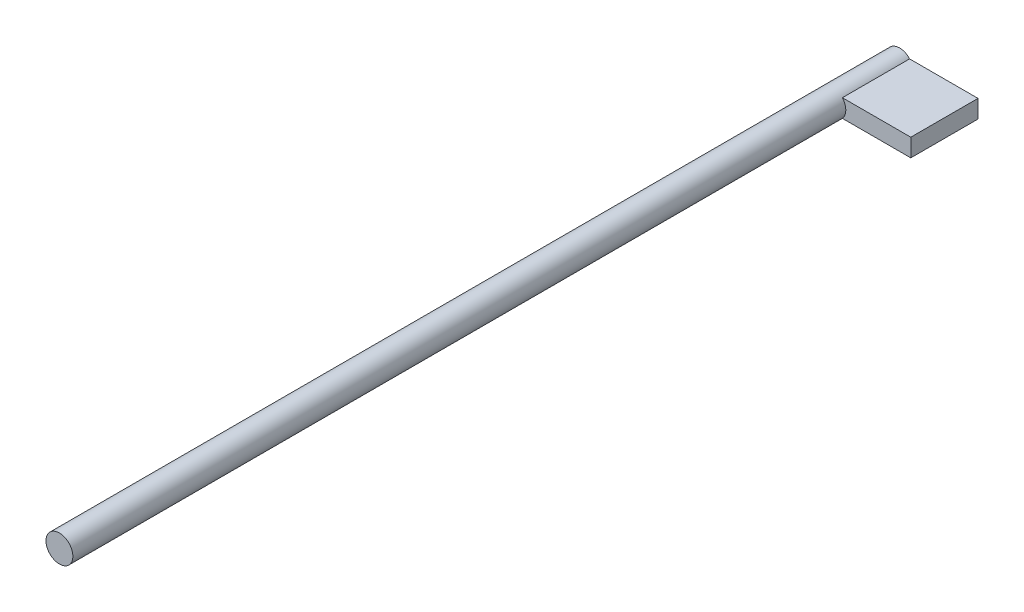
ISO-10303-21;
HEADER;
FILE_DESCRIPTION(('STEP AP214'),'2;1');
FILE_NAME('part.step','',(''),(''),'','','');
FILE_SCHEMA(('AUTOMOTIVE_DESIGN { 1 0 10303 214 1 1 1 1 }'));
ENDSEC;
DATA;
#1=APPLICATION_CONTEXT('core data for automotive mechanical design processes');
#2=APPLICATION_PROTOCOL_DEFINITION('international standard','automotive_design',2000,#1);
#3=PRODUCT_CONTEXT('',#1,'mechanical');
#4=PRODUCT('Part','Part','',(#3));
#5=PRODUCT_RELATED_PRODUCT_CATEGORY('part','',(#4));
#6=PRODUCT_DEFINITION_FORMATION('','',#4);
#7=PRODUCT_DEFINITION_CONTEXT('part definition',#1,'design');
#8=PRODUCT_DEFINITION('design','',#6,#7);
#9=PRODUCT_DEFINITION_SHAPE('','',#8);
#10=(LENGTH_UNIT() NAMED_UNIT(*) SI_UNIT(.MILLI.,.METRE.));
#11=(NAMED_UNIT(*) PLANE_ANGLE_UNIT() SI_UNIT($,.RADIAN.));
#12=(NAMED_UNIT(*) SI_UNIT($,.STERADIAN.) SOLID_ANGLE_UNIT());
#13=UNCERTAINTY_MEASURE_WITH_UNIT(LENGTH_MEASURE(1.E-05),#10,'distance_accuracy_value','');
#14=(GEOMETRIC_REPRESENTATION_CONTEXT(3) GLOBAL_UNCERTAINTY_ASSIGNED_CONTEXT((#13)) GLOBAL_UNIT_ASSIGNED_CONTEXT((#10,
#11,#12)) REPRESENTATION_CONTEXT('',''));
#15=CARTESIAN_POINT('',(0.,0.,0.));
#16=DIRECTION('',(0.,0.,1.));
#17=DIRECTION('',(1.,0.,0.));
#18=AXIS2_PLACEMENT_3D('',#15,#16,#17);
#19=CARTESIAN_POINT('',(0.,0.,-375.));
#20=DIRECTION('',(0.,0.,1.));
#21=DIRECTION('',(1.,0.,0.));
#22=AXIS2_PLACEMENT_3D('',#19,#20,#21);
#23=CYLINDRICAL_SURFACE('',#22,6.);
#24=CARTESIAN_POINT('',(0.,0.,0.));
#25=DIRECTION('',(0.,0.,1.));
#26=DIRECTION('',(1.,0.,0.));
#27=AXIS2_PLACEMENT_3D('',#24,#25,#26);
#28=CIRCLE('',#27,6.);
#29=CARTESIAN_POINT('',(6.,0.,0.));
#30=VERTEX_POINT('',#29);
#31=EDGE_CURVE('E121',#30,#30,#28,.T.);
#32=ORIENTED_EDGE('',*,*,#31,.F.);
#33=EDGE_LOOP('',(#32));
#34=FACE_BOUND('',#33,.T.);
#35=CARTESIAN_POINT('',(0.,0.,-375.));
#36=DIRECTION('',(0.,0.,1.));
#37=DIRECTION('',(1.,0.,0.));
#38=AXIS2_PLACEMENT_3D('',#35,#36,#37);
#39=CIRCLE('',#38,6.);
#40=CARTESIAN_POINT('',(4.47213595499957,4.00000000000001,-375.));
#41=VERTEX_POINT('',#40);
#42=CARTESIAN_POINT('',(4.47213595499959,-3.99999999999999,-375.));
#43=VERTEX_POINT('',#42);
#44=EDGE_CURVE('E47',#41,#43,#39,.T.);
#45=ORIENTED_EDGE('',*,*,#44,.T.);
#46=DIRECTION('',(0.,0.,1.));
#47=VECTOR('',#46,1.);
#48=CARTESIAN_POINT('',(4.47213595499959,-3.99999999999999,-375.));
#49=LINE('',#48,#47);
#50=CARTESIAN_POINT('',(4.47213595499959,-3.99999999999999,-345.));
#51=VERTEX_POINT('',#50);
#52=EDGE_CURVE('E54',#43,#51,#49,.T.);
#53=ORIENTED_EDGE('',*,*,#52,.T.);
#54=CARTESIAN_POINT('',(0.,0.,-345.));
#55=DIRECTION('',(0.,0.,1.));
#56=DIRECTION('',(1.,0.,0.));
#57=AXIS2_PLACEMENT_3D('',#54,#55,#56);
#58=CIRCLE('',#57,6.);
#59=CARTESIAN_POINT('',(4.47213595499957,4.00000000000001,-345.));
#60=VERTEX_POINT('',#59);
#61=EDGE_CURVE('E11',#60,#51,#58,.F.);
#62=ORIENTED_EDGE('',*,*,#61,.F.);
#63=DIRECTION('',(0.,0.,1.));
#64=VECTOR('',#63,1.);
#65=CARTESIAN_POINT('',(4.47213595499957,4.00000000000001,-375.));
#66=LINE('',#65,#64);
#67=EDGE_CURVE('E82',#41,#60,#66,.T.);
#68=ORIENTED_EDGE('',*,*,#67,.F.);
#69=EDGE_LOOP('',(#45,#53,#62,#68));
#70=FACE_BOUND('',#69,.T.);
#71=ADVANCED_FACE('F39',(#34,#70),#23,.T.);
#72=CARTESIAN_POINT('',(0.,0.,-375.));
#73=DIRECTION('',(0.,0.,1.));
#74=DIRECTION('',(1.,0.,0.));
#75=AXIS2_PLACEMENT_3D('',#72,#73,#74);
#76=PLANE('',#75);
#77=ORIENTED_EDGE('',*,*,#44,.F.);
#78=DIRECTION('',(-1.,0.,0.));
#79=VECTOR('',#78,1.);
#80=CARTESIAN_POINT('',(35.,4.00000000000001,-375.));
#81=LINE('',#80,#79);
#82=CARTESIAN_POINT('',(35.,4.00000000000001,-375.));
#83=VERTEX_POINT('',#82);
#84=EDGE_CURVE('E86',#83,#41,#81,.T.);
#85=ORIENTED_EDGE('',*,*,#84,.F.);
#86=DIRECTION('',(0.,1.,0.));
#87=VECTOR('',#86,1.);
#88=CARTESIAN_POINT('',(35.,-3.99999999999999,-375.));
#89=LINE('',#88,#87);
#90=CARTESIAN_POINT('',(35.,-3.99999999999999,-375.));
#91=VERTEX_POINT('',#90);
#92=EDGE_CURVE('E94',#91,#83,#89,.T.);
#93=ORIENTED_EDGE('',*,*,#92,.F.);
#94=DIRECTION('',(-1.,0.,0.));
#95=VECTOR('',#94,1.);
#96=CARTESIAN_POINT('',(35.,-3.99999999999999,-375.));
#97=LINE('',#96,#95);
#98=EDGE_CURVE('E111',#91,#43,#97,.T.);
#99=ORIENTED_EDGE('',*,*,#98,.T.);
#100=EDGE_LOOP('',(#77,#85,#93,#99));
#101=FACE_BOUND('',#100,.T.);
#102=ADVANCED_FACE('F130',(#101),#76,.F.);
#103=CARTESIAN_POINT('',(0.,0.,0.));
#104=DIRECTION('',(0.,0.,1.));
#105=DIRECTION('',(1.,0.,0.));
#106=AXIS2_PLACEMENT_3D('',#103,#104,#105);
#107=PLANE('',#106);
#108=ORIENTED_EDGE('',*,*,#31,.T.);
#109=EDGE_LOOP('',(#108));
#110=FACE_BOUND('',#109,.T.);
#111=ADVANCED_FACE('F127',(#110),#107,.T.);
#112=CARTESIAN_POINT('',(35.,-3.99999999999999,-345.));
#113=DIRECTION('',(0.,0.,1.));
#114=DIRECTION('',(1.,0.,0.));
#115=AXIS2_PLACEMENT_3D('',#112,#113,#114);
#116=PLANE('',#115);
#117=DIRECTION('',(-1.,0.,0.));
#118=VECTOR('',#117,1.);
#119=CARTESIAN_POINT('',(35.,4.00000000000001,-345.));
#120=LINE('',#119,#118);
#121=CARTESIAN_POINT('',(35.,4.00000000000001,-345.));
#122=VERTEX_POINT('',#121);
#123=EDGE_CURVE('E77',#122,#60,#120,.T.);
#124=ORIENTED_EDGE('',*,*,#123,.T.);
#125=ORIENTED_EDGE('',*,*,#61,.T.);
#126=DIRECTION('',(-1.,0.,0.));
#127=VECTOR('',#126,1.);
#128=CARTESIAN_POINT('',(35.,-3.99999999999999,-345.));
#129=LINE('',#128,#127);
#130=CARTESIAN_POINT('',(35.,-3.99999999999999,-345.));
#131=VERTEX_POINT('',#130);
#132=EDGE_CURVE('E100',#131,#51,#129,.T.);
#133=ORIENTED_EDGE('',*,*,#132,.F.);
#134=DIRECTION('',(0.,1.,0.));
#135=VECTOR('',#134,1.);
#136=CARTESIAN_POINT('',(35.,-3.99999999999999,-345.));
#137=LINE('',#136,#135);
#138=EDGE_CURVE('E92',#131,#122,#137,.T.);
#139=ORIENTED_EDGE('',*,*,#138,.T.);
#140=EDGE_LOOP('',(#124,#125,#133,#139));
#141=FACE_BOUND('',#140,.T.);
#142=ADVANCED_FACE('F98',(#141),#116,.T.);
#143=CARTESIAN_POINT('',(35.,-3.99999999999999,-345.));
#144=DIRECTION('',(0.,1.,0.));
#145=DIRECTION('',(0.,0.,1.));
#146=AXIS2_PLACEMENT_3D('',#143,#144,#145);
#147=PLANE('',#146);
#148=ORIENTED_EDGE('',*,*,#52,.F.);
#149=ORIENTED_EDGE('',*,*,#98,.F.);
#150=DIRECTION('',(0.,0.,-1.));
#151=VECTOR('',#150,1.);
#152=CARTESIAN_POINT('',(35.,-3.99999999999999,-345.));
#153=LINE('',#152,#151);
#154=EDGE_CURVE('E87',#131,#91,#153,.T.);
#155=ORIENTED_EDGE('',*,*,#154,.F.);
#156=ORIENTED_EDGE('',*,*,#132,.T.);
#157=EDGE_LOOP('',(#148,#149,#155,#156));
#158=FACE_BOUND('',#157,.T.);
#159=ADVANCED_FACE('F144',(#158),#147,.F.);
#160=CARTESIAN_POINT('',(35.,4.00000000000001,-345.));
#161=DIRECTION('',(0.,1.,0.));
#162=DIRECTION('',(0.,0.,1.));
#163=AXIS2_PLACEMENT_3D('',#160,#161,#162);
#164=PLANE('',#163);
#165=ORIENTED_EDGE('',*,*,#84,.T.);
#166=ORIENTED_EDGE('',*,*,#67,.T.);
#167=ORIENTED_EDGE('',*,*,#123,.F.);
#168=DIRECTION('',(0.,0.,-1.));
#169=VECTOR('',#168,1.);
#170=CARTESIAN_POINT('',(35.,4.00000000000001,-345.));
#171=LINE('',#170,#169);
#172=EDGE_CURVE('E81',#122,#83,#171,.T.);
#173=ORIENTED_EDGE('',*,*,#172,.T.);
#174=EDGE_LOOP('',(#165,#166,#167,#173));
#175=FACE_BOUND('',#174,.T.);
#176=ADVANCED_FACE('F80',(#175),#164,.T.);
#177=CARTESIAN_POINT('',(35.,0.,0.));
#178=DIRECTION('',(-1.,0.,0.));
#179=DIRECTION('',(0.,0.,1.));
#180=AXIS2_PLACEMENT_3D('',#177,#178,#179);
#181=PLANE('',#180);
#182=ORIENTED_EDGE('',*,*,#138,.F.);
#183=ORIENTED_EDGE('',*,*,#154,.T.);
#184=ORIENTED_EDGE('',*,*,#92,.T.);
#185=ORIENTED_EDGE('',*,*,#172,.F.);
#186=EDGE_LOOP('',(#182,#183,#184,#185));
#187=FACE_BOUND('',#186,.T.);
#188=ADVANCED_FACE('F91',(#187),#181,.F.);
#189=CLOSED_SHELL('',(#71,#102,#111,#142,#159,#176,#188));
#190=MANIFOLD_SOLID_BREP('B2',#189);
#191=ADVANCED_BREP_SHAPE_REPRESENTATION('',(#18,#190),#14);
#192=SHAPE_DEFINITION_REPRESENTATION(#9,#191);
ENDSEC;
END-ISO-10303-21;
